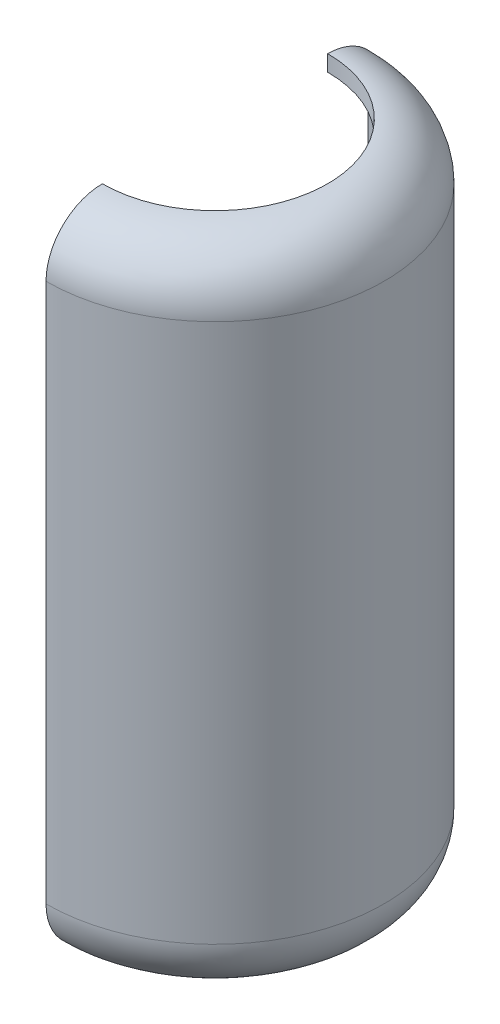
ISO-10303-21;
HEADER;
FILE_DESCRIPTION(('STEP AP214'),'2;1');
FILE_NAME('part.step','',(''),(''),'','','');
FILE_SCHEMA(('AUTOMOTIVE_DESIGN { 1 0 10303 214 1 1 1 1 }'));
ENDSEC;
DATA;
#1=APPLICATION_CONTEXT('core data for automotive mechanical design processes');
#2=APPLICATION_PROTOCOL_DEFINITION('international standard','automotive_design',2000,#1);
#3=PRODUCT_CONTEXT('',#1,'mechanical');
#4=PRODUCT('Part','Part','',(#3));
#5=PRODUCT_RELATED_PRODUCT_CATEGORY('part','',(#4));
#6=PRODUCT_DEFINITION_FORMATION('','',#4);
#7=PRODUCT_DEFINITION_CONTEXT('part definition',#1,'design');
#8=PRODUCT_DEFINITION('design','',#6,#7);
#9=PRODUCT_DEFINITION_SHAPE('','',#8);
#10=(LENGTH_UNIT() NAMED_UNIT(*) SI_UNIT(.MILLI.,.METRE.));
#11=(NAMED_UNIT(*) PLANE_ANGLE_UNIT() SI_UNIT($,.RADIAN.));
#12=(NAMED_UNIT(*) SI_UNIT($,.STERADIAN.) SOLID_ANGLE_UNIT());
#13=UNCERTAINTY_MEASURE_WITH_UNIT(LENGTH_MEASURE(1.E-05),#10,'distance_accuracy_value','');
#14=(GEOMETRIC_REPRESENTATION_CONTEXT(3) GLOBAL_UNCERTAINTY_ASSIGNED_CONTEXT((#13)) GLOBAL_UNIT_ASSIGNED_CONTEXT((#10,
#11,#12)) REPRESENTATION_CONTEXT('',''));
#15=CARTESIAN_POINT('',(0.,0.,0.));
#16=DIRECTION('',(0.,0.,1.));
#17=DIRECTION('',(1.,0.,0.));
#18=AXIS2_PLACEMENT_3D('',#15,#16,#17);
#19=CARTESIAN_POINT('',(0.,0.,0.));
#20=DIRECTION('',(1.,0.,0.));
#21=DIRECTION('',(0.,0.,-1.));
#22=AXIS2_PLACEMENT_3D('',#19,#20,#21);
#23=PLANE('',#22);
#24=DIRECTION('',(0.,1.,0.));
#25=VECTOR('',#24,1.);
#26=CARTESIAN_POINT('',(0.,40.5,7.));
#27=LINE('',#26,#25);
#28=CARTESIAN_POINT('',(0.,39.5,7.));
#29=VERTEX_POINT('',#28);
#30=CARTESIAN_POINT('',(0.,40.5,7.));
#31=VERTEX_POINT('',#30);
#32=EDGE_CURVE('E104',#29,#31,#27,.T.);
#33=ORIENTED_EDGE('',*,*,#32,.F.);
#34=CARTESIAN_POINT('',(0.,37.,7.));
#35=DIRECTION('',(1.,0.,0.));
#36=DIRECTION('',(0.,0.,-1.));
#37=AXIS2_PLACEMENT_3D('',#34,#35,#36);
#38=CIRCLE('',#37,2.5);
#39=CARTESIAN_POINT('',(0.,37.,9.5));
#40=VERTEX_POINT('',#39);
#41=EDGE_CURVE('E131',#40,#29,#38,.F.);
#42=ORIENTED_EDGE('',*,*,#41,.F.);
#43=DIRECTION('',(0.,-1.,0.));
#44=VECTOR('',#43,1.);
#45=CARTESIAN_POINT('',(0.,37.,9.5));
#46=LINE('',#45,#44);
#47=CARTESIAN_POINT('',(0.,3.5,9.5));
#48=VERTEX_POINT('',#47);
#49=EDGE_CURVE('E144',#40,#48,#46,.T.);
#50=ORIENTED_EDGE('',*,*,#49,.T.);
#51=CARTESIAN_POINT('',(0.,3.5,7.));
#52=DIRECTION('',(1.,0.,0.));
#53=DIRECTION('',(0.,0.,-1.));
#54=AXIS2_PLACEMENT_3D('',#51,#52,#53);
#55=CIRCLE('',#54,2.5);
#56=CARTESIAN_POINT('',(0.,1.,7.));
#57=VERTEX_POINT('',#56);
#58=EDGE_CURVE('E146',#57,#48,#55,.F.);
#59=ORIENTED_EDGE('',*,*,#58,.F.);
#60=DIRECTION('',(0.,0.,-1.));
#61=VECTOR('',#60,1.);
#62=CARTESIAN_POINT('',(0.,1.,0.));
#63=LINE('',#62,#61);
#64=CARTESIAN_POINT('',(0.,1.,-7.));
#65=VERTEX_POINT('',#64);
#66=EDGE_CURVE('E152',#57,#65,#63,.T.);
#67=ORIENTED_EDGE('',*,*,#66,.T.);
#68=CARTESIAN_POINT('',(0.,3.5,-7.));
#69=DIRECTION('',(1.,0.,0.));
#70=DIRECTION('',(0.,0.,-1.));
#71=AXIS2_PLACEMENT_3D('',#68,#69,#70);
#72=CIRCLE('',#71,2.5);
#73=CARTESIAN_POINT('',(0.,3.5,-9.5));
#74=VERTEX_POINT('',#73);
#75=EDGE_CURVE('E138',#74,#65,#72,.F.);
#76=ORIENTED_EDGE('',*,*,#75,.F.);
#77=DIRECTION('',(0.,-1.,0.));
#78=VECTOR('',#77,1.);
#79=CARTESIAN_POINT('',(0.,3.5,-9.5));
#80=LINE('',#79,#78);
#81=CARTESIAN_POINT('',(0.,37.,-9.5));
#82=VERTEX_POINT('',#81);
#83=EDGE_CURVE('E150',#74,#82,#80,.F.);
#84=ORIENTED_EDGE('',*,*,#83,.T.);
#85=CARTESIAN_POINT('',(0.,37.,-7.));
#86=DIRECTION('',(1.,0.,0.));
#87=DIRECTION('',(0.,0.,-1.));
#88=AXIS2_PLACEMENT_3D('',#85,#86,#87);
#89=CIRCLE('',#88,2.5);
#90=CARTESIAN_POINT('',(0.,39.5,-7.));
#91=VERTEX_POINT('',#90);
#92=EDGE_CURVE('E112',#91,#82,#89,.F.);
#93=ORIENTED_EDGE('',*,*,#92,.F.);
#94=DIRECTION('',(0.,1.,0.));
#95=VECTOR('',#94,1.);
#96=CARTESIAN_POINT('',(0.,40.5,-7.));
#97=LINE('',#96,#95);
#98=CARTESIAN_POINT('',(0.,40.5,-7.));
#99=VERTEX_POINT('',#98);
#100=EDGE_CURVE('E101',#91,#99,#97,.T.);
#101=ORIENTED_EDGE('',*,*,#100,.T.);
#102=CARTESIAN_POINT('',(0.,37.,-7.));
#103=DIRECTION('',(1.,0.,0.));
#104=DIRECTION('',(0.,0.,-1.));
#105=AXIS2_PLACEMENT_3D('',#102,#103,#104);
#106=CIRCLE('',#105,3.5);
#107=CARTESIAN_POINT('',(0.,37.,-10.5));
#108=VERTEX_POINT('',#107);
#109=EDGE_CURVE('E11',#99,#108,#106,.F.);
#110=ORIENTED_EDGE('',*,*,#109,.T.);
#111=DIRECTION('',(0.,-1.,0.));
#112=VECTOR('',#111,1.);
#113=CARTESIAN_POINT('',(0.,40.5,-10.5));
#114=LINE('',#113,#112);
#115=CARTESIAN_POINT('',(0.,3.5,-10.5));
#116=VERTEX_POINT('',#115);
#117=EDGE_CURVE('E124',#116,#108,#114,.F.);
#118=ORIENTED_EDGE('',*,*,#117,.F.);
#119=CARTESIAN_POINT('',(0.,3.5,-7.));
#120=DIRECTION('',(1.,0.,0.));
#121=DIRECTION('',(0.,0.,-1.));
#122=AXIS2_PLACEMENT_3D('',#119,#120,#121);
#123=CIRCLE('',#122,3.5);
#124=CARTESIAN_POINT('',(0.,0.,-7.));
#125=VERTEX_POINT('',#124);
#126=EDGE_CURVE('E120',#116,#125,#123,.F.);
#127=ORIENTED_EDGE('',*,*,#126,.T.);
#128=DIRECTION('',(0.,0.,-1.));
#129=VECTOR('',#128,1.);
#130=CARTESIAN_POINT('',(0.,0.,0.));
#131=LINE('',#130,#129);
#132=CARTESIAN_POINT('',(0.,0.,7.));
#133=VERTEX_POINT('',#132);
#134=EDGE_CURVE('E158',#133,#125,#131,.T.);
#135=ORIENTED_EDGE('',*,*,#134,.F.);
#136=CARTESIAN_POINT('',(0.,3.5,7.));
#137=DIRECTION('',(1.,0.,0.));
#138=DIRECTION('',(0.,0.,-1.));
#139=AXIS2_PLACEMENT_3D('',#136,#137,#138);
#140=CIRCLE('',#139,3.5);
#141=CARTESIAN_POINT('',(0.,3.5,10.5));
#142=VERTEX_POINT('',#141);
#143=EDGE_CURVE('E133',#133,#142,#140,.F.);
#144=ORIENTED_EDGE('',*,*,#143,.T.);
#145=DIRECTION('',(0.,-1.,0.));
#146=VECTOR('',#145,1.);
#147=CARTESIAN_POINT('',(0.,40.5,10.5));
#148=LINE('',#147,#146);
#149=CARTESIAN_POINT('',(0.,37.,10.5));
#150=VERTEX_POINT('',#149);
#151=EDGE_CURVE('E56',#150,#142,#148,.T.);
#152=ORIENTED_EDGE('',*,*,#151,.F.);
#153=CARTESIAN_POINT('',(0.,37.,7.));
#154=DIRECTION('',(1.,0.,0.));
#155=DIRECTION('',(0.,0.,-1.));
#156=AXIS2_PLACEMENT_3D('',#153,#154,#155);
#157=CIRCLE('',#156,3.5);
#158=EDGE_CURVE('E41',#150,#31,#157,.F.);
#159=ORIENTED_EDGE('',*,*,#158,.T.);
#160=EDGE_LOOP('',(#33,#42,#50,#59,#67,#76,#84,#93,#101,#110,#118,#127,#135,#144,#152,#159));
#161=FACE_BOUND('',#160,.T.);
#162=ADVANCED_FACE('F33',(#161),#23,.F.);
#163=CARTESIAN_POINT('',(0.,40.5,0.));
#164=DIRECTION('',(0.,-1.,0.));
#165=DIRECTION('',(0.,0.,-1.));
#166=AXIS2_PLACEMENT_3D('',#163,#164,#165);
#167=CYLINDRICAL_SURFACE('',#166,10.5);
#168=CARTESIAN_POINT('',(0.,37.,0.));
#169=DIRECTION('',(0.,1.,0.));
#170=DIRECTION('',(0.,0.,1.));
#171=AXIS2_PLACEMENT_3D('',#168,#169,#170);
#172=CIRCLE('',#171,10.5);
#173=EDGE_CURVE('E117',#108,#150,#172,.F.);
#174=ORIENTED_EDGE('',*,*,#173,.T.);
#175=ORIENTED_EDGE('',*,*,#151,.T.);
#176=CARTESIAN_POINT('',(0.,3.5,0.));
#177=DIRECTION('',(0.,1.,0.));
#178=DIRECTION('',(0.,0.,1.));
#179=AXIS2_PLACEMENT_3D('',#176,#177,#178);
#180=CIRCLE('',#179,10.5);
#181=EDGE_CURVE('E119',#142,#116,#180,.T.);
#182=ORIENTED_EDGE('',*,*,#181,.T.);
#183=ORIENTED_EDGE('',*,*,#117,.T.);
#184=EDGE_LOOP('',(#174,#175,#182,#183));
#185=FACE_BOUND('',#184,.T.);
#186=ADVANCED_FACE('F160',(#185),#167,.T.);
#187=CARTESIAN_POINT('',(0.,0.,0.));
#188=DIRECTION('',(0.,1.,0.));
#189=DIRECTION('',(0.,0.,1.));
#190=AXIS2_PLACEMENT_3D('',#187,#188,#189);
#191=PLANE('',#190);
#192=CARTESIAN_POINT('',(0.,0.,0.));
#193=DIRECTION('',(0.,1.,0.));
#194=DIRECTION('',(0.,0.,1.));
#195=AXIS2_PLACEMENT_3D('',#192,#193,#194);
#196=CIRCLE('',#195,7.);
#197=EDGE_CURVE('E107',#125,#133,#196,.F.);
#198=ORIENTED_EDGE('',*,*,#197,.T.);
#199=ORIENTED_EDGE('',*,*,#134,.T.);
#200=EDGE_LOOP('',(#198,#199));
#201=FACE_BOUND('',#200,.T.);
#202=ADVANCED_FACE('F168',(#201),#191,.F.);
#203=CARTESIAN_POINT('',(0.,3.5,0.));
#204=DIRECTION('',(0.,1.,0.));
#205=DIRECTION('',(0.,0.,1.));
#206=AXIS2_PLACEMENT_3D('',#203,#204,#205);
#207=TOROIDAL_SURFACE('',#206,7.,3.5);
#208=ORIENTED_EDGE('',*,*,#126,.F.);
#209=ORIENTED_EDGE('',*,*,#181,.F.);
#210=ORIENTED_EDGE('',*,*,#143,.F.);
#211=ORIENTED_EDGE('',*,*,#197,.F.);
#212=EDGE_LOOP('',(#208,#209,#210,#211));
#213=FACE_BOUND('',#212,.T.);
#214=ADVANCED_FACE('F165',(#213),#207,.T.);
#215=CARTESIAN_POINT('',(0.,37.,0.));
#216=DIRECTION('',(0.,1.,0.));
#217=DIRECTION('',(0.,0.,1.));
#218=AXIS2_PLACEMENT_3D('',#215,#216,#217);
#219=TOROIDAL_SURFACE('',#218,7.,3.5);
#220=ORIENTED_EDGE('',*,*,#109,.F.);
#221=CARTESIAN_POINT('',(0.,40.5,0.));
#222=DIRECTION('',(0.,1.,0.));
#223=DIRECTION('',(0.,0.,1.));
#224=AXIS2_PLACEMENT_3D('',#221,#222,#223);
#225=CIRCLE('',#224,7.);
#226=EDGE_CURVE('E97',#31,#99,#225,.T.);
#227=ORIENTED_EDGE('',*,*,#226,.F.);
#228=ORIENTED_EDGE('',*,*,#158,.F.);
#229=ORIENTED_EDGE('',*,*,#173,.F.);
#230=EDGE_LOOP('',(#220,#227,#228,#229));
#231=FACE_BOUND('',#230,.T.);
#232=ADVANCED_FACE('F35',(#231),#219,.T.);
#233=CARTESIAN_POINT('',(0.,40.5,0.));
#234=DIRECTION('',(0.,1.,0.));
#235=DIRECTION('',(0.,0.,1.));
#236=AXIS2_PLACEMENT_3D('',#233,#234,#235);
#237=CYLINDRICAL_SURFACE('',#236,7.);
#238=ORIENTED_EDGE('',*,*,#226,.T.);
#239=ORIENTED_EDGE('',*,*,#100,.F.);
#240=CARTESIAN_POINT('',(0.,39.5,0.));
#241=DIRECTION('',(0.,-1.,0.));
#242=DIRECTION('',(0.,0.,-1.));
#243=AXIS2_PLACEMENT_3D('',#240,#241,#242);
#244=CIRCLE('',#243,7.);
#245=EDGE_CURVE('E113',#29,#91,#244,.F.);
#246=ORIENTED_EDGE('',*,*,#245,.F.);
#247=ORIENTED_EDGE('',*,*,#32,.T.);
#248=EDGE_LOOP('',(#238,#239,#246,#247));
#249=FACE_BOUND('',#248,.T.);
#250=ADVANCED_FACE('F99',(#249),#237,.F.);
#251=CARTESIAN_POINT('',(0.,40.5,0.));
#252=DIRECTION('',(0.,-1.,0.));
#253=DIRECTION('',(0.,0.,-1.));
#254=AXIS2_PLACEMENT_3D('',#251,#252,#253);
#255=CYLINDRICAL_SURFACE('',#254,9.5);
#256=CARTESIAN_POINT('',(0.,37.,0.));
#257=DIRECTION('',(0.,-1.,0.));
#258=DIRECTION('',(0.,0.,-1.));
#259=AXIS2_PLACEMENT_3D('',#256,#257,#258);
#260=CIRCLE('',#259,9.5);
#261=EDGE_CURVE('E48',#82,#40,#260,.T.);
#262=ORIENTED_EDGE('',*,*,#261,.F.);
#263=ORIENTED_EDGE('',*,*,#83,.F.);
#264=CARTESIAN_POINT('',(0.,3.5,0.));
#265=DIRECTION('',(0.,-1.,0.));
#266=DIRECTION('',(0.,0.,-1.));
#267=AXIS2_PLACEMENT_3D('',#264,#265,#266);
#268=CIRCLE('',#267,9.5);
#269=EDGE_CURVE('E137',#48,#74,#268,.F.);
#270=ORIENTED_EDGE('',*,*,#269,.F.);
#271=ORIENTED_EDGE('',*,*,#49,.F.);
#272=EDGE_LOOP('',(#262,#263,#270,#271));
#273=FACE_BOUND('',#272,.T.);
#274=ADVANCED_FACE('F192',(#273),#255,.F.);
#275=CARTESIAN_POINT('',(0.,1.,0.));
#276=DIRECTION('',(0.,1.,0.));
#277=DIRECTION('',(0.,0.,1.));
#278=AXIS2_PLACEMENT_3D('',#275,#276,#277);
#279=PLANE('',#278);
#280=CARTESIAN_POINT('',(0.,1.,0.));
#281=DIRECTION('',(0.,1.,0.));
#282=DIRECTION('',(0.,0.,1.));
#283=AXIS2_PLACEMENT_3D('',#280,#281,#282);
#284=CIRCLE('',#283,7.);
#285=EDGE_CURVE('E141',#65,#57,#284,.F.);
#286=ORIENTED_EDGE('',*,*,#285,.F.);
#287=ORIENTED_EDGE('',*,*,#66,.F.);
#288=EDGE_LOOP('',(#286,#287));
#289=FACE_BOUND('',#288,.T.);
#290=ADVANCED_FACE('F188',(#289),#279,.T.);
#291=CARTESIAN_POINT('',(0.,3.5,0.));
#292=DIRECTION('',(0.,1.,0.));
#293=DIRECTION('',(0.,0.,1.));
#294=AXIS2_PLACEMENT_3D('',#291,#292,#293);
#295=TOROIDAL_SURFACE('',#294,7.,2.5);
#296=ORIENTED_EDGE('',*,*,#75,.T.);
#297=ORIENTED_EDGE('',*,*,#285,.T.);
#298=ORIENTED_EDGE('',*,*,#58,.T.);
#299=ORIENTED_EDGE('',*,*,#269,.T.);
#300=EDGE_LOOP('',(#296,#297,#298,#299));
#301=FACE_BOUND('',#300,.T.);
#302=ADVANCED_FACE('F184',(#301),#295,.F.);
#303=CARTESIAN_POINT('',(0.,37.,0.));
#304=DIRECTION('',(0.,1.,0.));
#305=DIRECTION('',(0.,0.,1.));
#306=AXIS2_PLACEMENT_3D('',#303,#304,#305);
#307=TOROIDAL_SURFACE('',#306,7.,2.5);
#308=ORIENTED_EDGE('',*,*,#92,.T.);
#309=ORIENTED_EDGE('',*,*,#261,.T.);
#310=ORIENTED_EDGE('',*,*,#41,.T.);
#311=ORIENTED_EDGE('',*,*,#245,.T.);
#312=EDGE_LOOP('',(#308,#309,#310,#311));
#313=FACE_BOUND('',#312,.T.);
#314=ADVANCED_FACE('F181',(#313),#307,.F.);
#315=CLOSED_SHELL('',(#162,#186,#202,#214,#232,#250,#274,#290,#302,#314));
#316=MANIFOLD_SOLID_BREP('B2',#315);
#317=ADVANCED_BREP_SHAPE_REPRESENTATION('',(#18,#316),#14);
#318=SHAPE_DEFINITION_REPRESENTATION(#9,#317);
ENDSEC;
END-ISO-10303-21;
